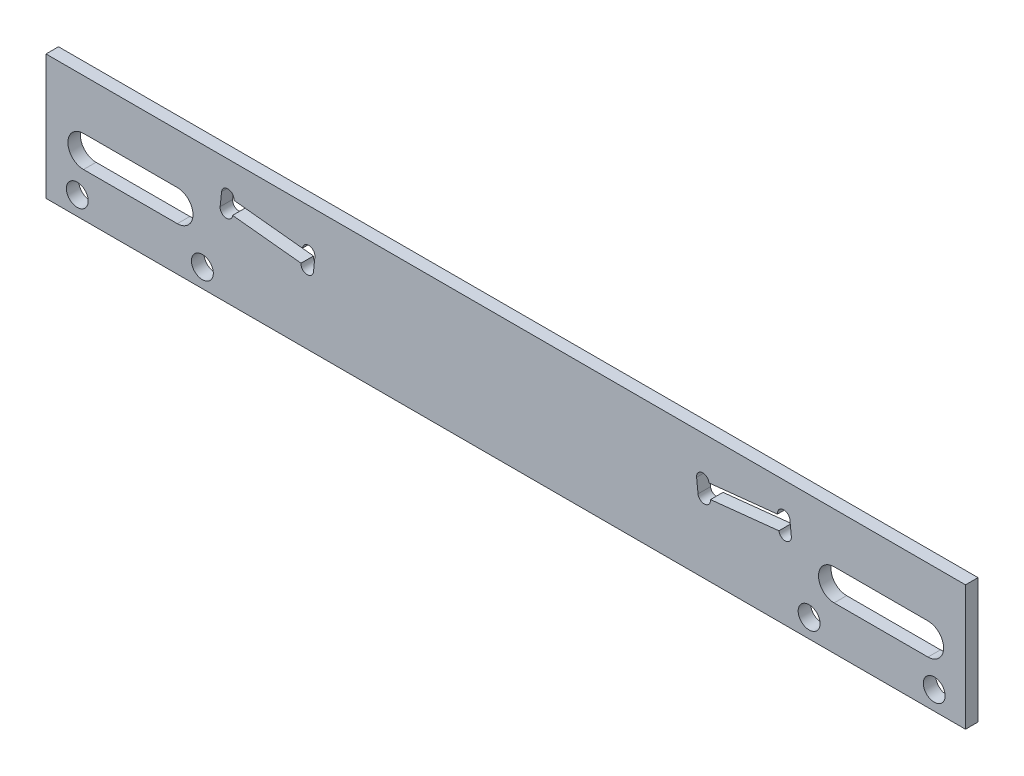
ISO-10303-21;
HEADER;
FILE_DESCRIPTION(('STEP AP214'),'2;1');
FILE_NAME('part.step','',(''),(''),'','','');
FILE_SCHEMA(('AUTOMOTIVE_DESIGN { 1 0 10303 214 1 1 1 1 }'));
ENDSEC;
DATA;
#1=APPLICATION_CONTEXT('core data for automotive mechanical design processes');
#2=APPLICATION_PROTOCOL_DEFINITION('international standard','automotive_design',2000,#1);
#3=PRODUCT_CONTEXT('',#1,'mechanical');
#4=PRODUCT('Part','Part','',(#3));
#5=PRODUCT_RELATED_PRODUCT_CATEGORY('part','',(#4));
#6=PRODUCT_DEFINITION_FORMATION('','',#4);
#7=PRODUCT_DEFINITION_CONTEXT('part definition',#1,'design');
#8=PRODUCT_DEFINITION('design','',#6,#7);
#9=PRODUCT_DEFINITION_SHAPE('','',#8);
#10=(LENGTH_UNIT() NAMED_UNIT(*) SI_UNIT(.MILLI.,.METRE.));
#11=(NAMED_UNIT(*) PLANE_ANGLE_UNIT() SI_UNIT($,.RADIAN.));
#12=(NAMED_UNIT(*) SI_UNIT($,.STERADIAN.) SOLID_ANGLE_UNIT());
#13=UNCERTAINTY_MEASURE_WITH_UNIT(LENGTH_MEASURE(1.E-05),#10,'distance_accuracy_value','');
#14=(GEOMETRIC_REPRESENTATION_CONTEXT(3) GLOBAL_UNCERTAINTY_ASSIGNED_CONTEXT((#13)) GLOBAL_UNIT_ASSIGNED_CONTEXT((#10,
#11,#12)) REPRESENTATION_CONTEXT('',''));
#15=CARTESIAN_POINT('',(0.,0.,0.));
#16=DIRECTION('',(0.,0.,1.));
#17=DIRECTION('',(1.,0.,0.));
#18=AXIS2_PLACEMENT_3D('',#15,#16,#17);
#19=CARTESIAN_POINT('',(0.,0.,2.));
#20=DIRECTION('',(0.,0.,1.));
#21=DIRECTION('',(1.,0.,0.));
#22=AXIS2_PLACEMENT_3D('',#19,#20,#21);
#23=PLANE('',#22);
#24=CARTESIAN_POINT('',(52.5,-0.499999999999997,2.));
#25=DIRECTION('',(0.,0.,1.));
#26=DIRECTION('',(1.,0.,0.));
#27=AXIS2_PLACEMENT_3D('',#24,#25,#26);
#28=CIRCLE('',#27,2.5);
#29=CARTESIAN_POINT('',(52.5,2.,2.));
#30=VERTEX_POINT('',#29);
#31=CARTESIAN_POINT('',(52.5,-3.,2.));
#32=VERTEX_POINT('',#31);
#33=EDGE_CURVE('E256',#30,#32,#28,.T.);
#34=ORIENTED_EDGE('',*,*,#33,.F.);
#35=DIRECTION('',(-1.,0.,0.));
#36=VECTOR('',#35,1.);
#37=CARTESIAN_POINT('',(52.5,2.,2.));
#38=LINE('',#37,#36);
#39=CARTESIAN_POINT('',(67.5,2.,2.));
#40=VERTEX_POINT('',#39);
#41=EDGE_CURVE('E264',#40,#30,#38,.T.);
#42=ORIENTED_EDGE('',*,*,#41,.F.);
#43=CARTESIAN_POINT('',(67.5,-0.499999999999997,2.));
#44=DIRECTION('',(0.,0.,1.));
#45=DIRECTION('',(1.,0.,0.));
#46=AXIS2_PLACEMENT_3D('',#43,#44,#45);
#47=CIRCLE('',#46,2.5);
#48=CARTESIAN_POINT('',(67.5,-3.,2.));
#49=VERTEX_POINT('',#48);
#50=EDGE_CURVE('E278',#49,#40,#47,.T.);
#51=ORIENTED_EDGE('',*,*,#50,.F.);
#52=DIRECTION('',(1.,0.,0.));
#53=VECTOR('',#52,1.);
#54=CARTESIAN_POINT('',(52.5,-3.,2.));
#55=LINE('',#54,#53);
#56=EDGE_CURVE('E275',#32,#49,#55,.T.);
#57=ORIENTED_EDGE('',*,*,#56,.F.);
#58=EDGE_LOOP('',(#34,#42,#51,#57));
#59=FACE_BOUND('',#58,.T.);
#60=CARTESIAN_POINT('',(-68.5,-6.99999999999999,2.));
#61=DIRECTION('',(0.,0.,-1.));
#62=DIRECTION('',(-1.,0.,0.));
#63=AXIS2_PLACEMENT_3D('',#60,#61,#62);
#64=CIRCLE('',#63,1.75);
#65=CARTESIAN_POINT('',(-70.25,-6.99999999999999,2.));
#66=VERTEX_POINT('',#65);
#67=EDGE_CURVE('E292',#66,#66,#64,.T.);
#68=ORIENTED_EDGE('',*,*,#67,.T.);
#69=EDGE_LOOP('',(#68));
#70=FACE_BOUND('',#69,.T.);
#71=CARTESIAN_POINT('',(-48.5,-7.,2.));
#72=DIRECTION('',(0.,0.,-1.));
#73=DIRECTION('',(-1.,0.,0.));
#74=AXIS2_PLACEMENT_3D('',#71,#72,#73);
#75=CIRCLE('',#74,1.75);
#76=CARTESIAN_POINT('',(-50.25,-7.,2.));
#77=VERTEX_POINT('',#76);
#78=EDGE_CURVE('E299',#77,#77,#75,.T.);
#79=ORIENTED_EDGE('',*,*,#78,.T.);
#80=EDGE_LOOP('',(#79));
#81=FACE_BOUND('',#80,.T.);
#82=CARTESIAN_POINT('',(48.5,-6.99999999999999,2.));
#83=DIRECTION('',(0.,0.,-1.));
#84=DIRECTION('',(-1.,0.,0.));
#85=AXIS2_PLACEMENT_3D('',#82,#83,#84);
#86=CIRCLE('',#85,1.75);
#87=CARTESIAN_POINT('',(46.75,-6.99999999999999,2.));
#88=VERTEX_POINT('',#87);
#89=EDGE_CURVE('E305',#88,#88,#86,.T.);
#90=ORIENTED_EDGE('',*,*,#89,.T.);
#91=EDGE_LOOP('',(#90));
#92=FACE_BOUND('',#91,.T.);
#93=CARTESIAN_POINT('',(68.4999999999999,-6.99999999999999,2.));
#94=DIRECTION('',(0.,0.,-1.));
#95=DIRECTION('',(-1.,0.,0.));
#96=AXIS2_PLACEMENT_3D('',#93,#94,#95);
#97=CIRCLE('',#96,1.75);
#98=CARTESIAN_POINT('',(66.7499999999999,-6.99999999999999,2.));
#99=VERTEX_POINT('',#98);
#100=EDGE_CURVE('E311',#99,#99,#97,.T.);
#101=ORIENTED_EDGE('',*,*,#100,.T.);
#102=EDGE_LOOP('',(#101));
#103=FACE_BOUND('',#102,.T.);
#104=CARTESIAN_POINT('',(31.7353868630574,1.31355228558448,2.));
#105=DIRECTION('',(0.,0.,1.));
#106=DIRECTION('',(1.,0.,0.));
#107=AXIS2_PLACEMENT_3D('',#104,#105,#106);
#108=CIRCLE('',#107,0.999999999999998);
#109=CARTESIAN_POINT('',(30.7408649676891,1.20902382231683,2.));
#110=VERTEX_POINT('',#109);
#111=CARTESIAN_POINT('',(32.7299087584256,1.41808074885212,2.));
#112=VERTEX_POINT('',#111);
#113=EDGE_CURVE('E376',#110,#112,#108,.T.);
#114=ORIENTED_EDGE('',*,*,#113,.F.);
#115=DIRECTION('',(0.104528463267649,-0.994521895368274,0.));
#116=VECTOR('',#115,1.);
#117=CARTESIAN_POINT('',(30.5109023485003,3.39697199212703,2.));
#118=LINE('',#117,#116);
#119=CARTESIAN_POINT('',(30.5109023485003,3.39697199212703,2.));
#120=VERTEX_POINT('',#119);
#121=EDGE_CURVE('E398',#120,#110,#118,.T.);
#122=ORIENTED_EDGE('',*,*,#121,.F.);
#123=CARTESIAN_POINT('',(31.5054242438685,3.50150045539468,2.));
#124=DIRECTION('',(0.,0.,1.));
#125=DIRECTION('',(1.,0.,0.));
#126=AXIS2_PLACEMENT_3D('',#123,#124,#125);
#127=CIRCLE('',#126,0.999999999999998);
#128=CARTESIAN_POINT('',(32.4999461392368,3.60602891866233,2.));
#129=VERTEX_POINT('',#128);
#130=EDGE_CURVE('E375',#129,#120,#127,.T.);
#131=ORIENTED_EDGE('',*,*,#130,.F.);
#132=DIRECTION('',(-0.994521895368274,-0.10452846326765,0.));
#133=VECTOR('',#132,1.);
#134=CARTESIAN_POINT('',(45.4287307790244,4.96489894114178,2.));
#135=LINE('',#134,#133);
#136=CARTESIAN_POINT('',(43.4396869882878,4.75584201460648,2.));
#137=VERTEX_POINT('',#136);
#138=EDGE_CURVE('E395',#137,#129,#135,.T.);
#139=ORIENTED_EDGE('',*,*,#138,.F.);
#140=CARTESIAN_POINT('',(44.4342088836561,4.86037047787413,2.));
#141=DIRECTION('',(0.,0.,1.));
#142=DIRECTION('',(1.,0.,0.));
#143=AXIS2_PLACEMENT_3D('',#140,#141,#142);
#144=CIRCLE('',#143,0.999999999999998);
#145=CARTESIAN_POINT('',(45.4287307790244,4.96489894114178,2.));
#146=VERTEX_POINT('',#145);
#147=EDGE_CURVE('E370',#146,#137,#144,.T.);
#148=ORIENTED_EDGE('',*,*,#147,.F.);
#149=DIRECTION('',(-0.104528463267651,0.994521895368274,0.));
#150=VECTOR('',#149,1.);
#151=CARTESIAN_POINT('',(45.6586933982132,2.77695077133158,2.));
#152=LINE('',#151,#150);
#153=CARTESIAN_POINT('',(45.6586933982132,2.77695077133158,2.));
#154=VERTEX_POINT('',#153);
#155=EDGE_CURVE('E404',#154,#146,#152,.T.);
#156=ORIENTED_EDGE('',*,*,#155,.F.);
#157=CARTESIAN_POINT('',(44.6641715028449,2.67242230806393,2.));
#158=DIRECTION('',(0.,0.,1.));
#159=DIRECTION('',(1.,0.,0.));
#160=AXIS2_PLACEMENT_3D('',#157,#158,#159);
#161=CIRCLE('',#160,0.999999999999998);
#162=CARTESIAN_POINT('',(43.6696496074767,2.56789384479628,2.));
#163=VERTEX_POINT('',#162);
#164=EDGE_CURVE('E359',#163,#154,#161,.T.);
#165=ORIENTED_EDGE('',*,*,#164,.F.);
#166=DIRECTION('',(0.994521895368274,0.10452846326765,0.));
#167=VECTOR('',#166,1.);
#168=CARTESIAN_POINT('',(30.7408649676891,1.20902382231683,2.));
#169=LINE('',#168,#167);
#170=EDGE_CURVE('E401',#112,#163,#169,.T.);
#171=ORIENTED_EDGE('',*,*,#170,.F.);
#172=EDGE_LOOP('',(#114,#122,#131,#139,#148,#156,#165,#171));
#173=FACE_BOUND('',#172,.T.);
#174=DIRECTION('',(0.,1.,0.));
#175=VECTOR('',#174,1.);
#176=CARTESIAN_POINT('',(73.5,10.,2.));
#177=LINE('',#176,#175);
#178=CARTESIAN_POINT('',(73.5,-10.,2.));
#179=VERTEX_POINT('',#178);
#180=CARTESIAN_POINT('',(73.5,10.,2.));
#181=VERTEX_POINT('',#180);
#182=EDGE_CURVE('E418',#179,#181,#177,.T.);
#183=ORIENTED_EDGE('',*,*,#182,.T.);
#184=DIRECTION('',(-1.,0.,0.));
#185=VECTOR('',#184,1.);
#186=CARTESIAN_POINT('',(-73.5,10.,2.));
#187=LINE('',#186,#185);
#188=CARTESIAN_POINT('',(-73.5,10.,2.));
#189=VERTEX_POINT('',#188);
#190=EDGE_CURVE('E421',#181,#189,#187,.T.);
#191=ORIENTED_EDGE('',*,*,#190,.T.);
#192=DIRECTION('',(0.,-1.,0.));
#193=VECTOR('',#192,1.);
#194=CARTESIAN_POINT('',(-73.5,10.,2.));
#195=LINE('',#194,#193);
#196=CARTESIAN_POINT('',(-73.5,-10.,2.));
#197=VERTEX_POINT('',#196);
#198=EDGE_CURVE('E424',#189,#197,#195,.T.);
#199=ORIENTED_EDGE('',*,*,#198,.T.);
#200=DIRECTION('',(1.,0.,0.));
#201=VECTOR('',#200,1.);
#202=CARTESIAN_POINT('',(-73.5,-10.,2.));
#203=LINE('',#202,#201);
#204=EDGE_CURVE('E426',#197,#179,#203,.T.);
#205=ORIENTED_EDGE('',*,*,#204,.T.);
#206=EDGE_LOOP('',(#183,#191,#199,#205));
#207=FACE_BOUND('',#206,.T.);
#208=DIRECTION('',(-0.104528463267649,-0.994521895368274,0.));
#209=VECTOR('',#208,1.);
#210=CARTESIAN_POINT('',(-30.5109023485003,3.39697199212703,2.));
#211=LINE('',#210,#209);
#212=CARTESIAN_POINT('',(-30.5109023485003,3.39697199212703,2.));
#213=VERTEX_POINT('',#212);
#214=CARTESIAN_POINT('',(-30.7408649676891,1.20902382231683,2.));
#215=VERTEX_POINT('',#214);
#216=EDGE_CURVE('E353',#213,#215,#211,.T.);
#217=ORIENTED_EDGE('',*,*,#216,.T.);
#218=CARTESIAN_POINT('',(-31.7353868630574,1.31355228558448,2.));
#219=DIRECTION('',(0.,0.,-1.));
#220=DIRECTION('',(-1.,0.,0.));
#221=AXIS2_PLACEMENT_3D('',#218,#219,#220);
#222=CIRCLE('',#221,0.999999999999998);
#223=CARTESIAN_POINT('',(-32.7299087584256,1.41808074885212,2.));
#224=VERTEX_POINT('',#223);
#225=EDGE_CURVE('E324',#215,#224,#222,.T.);
#226=ORIENTED_EDGE('',*,*,#225,.T.);
#227=DIRECTION('',(-0.994521895368274,0.10452846326765,0.));
#228=VECTOR('',#227,1.);
#229=CARTESIAN_POINT('',(-30.7408649676891,1.20902382231683,2.));
#230=LINE('',#229,#228);
#231=CARTESIAN_POINT('',(-43.6696496074767,2.56789384479628,2.));
#232=VERTEX_POINT('',#231);
#233=EDGE_CURVE('E350',#224,#232,#230,.T.);
#234=ORIENTED_EDGE('',*,*,#233,.T.);
#235=CARTESIAN_POINT('',(-44.6641715028449,2.67242230806393,2.));
#236=DIRECTION('',(0.,0.,-1.));
#237=DIRECTION('',(-1.,0.,0.));
#238=AXIS2_PLACEMENT_3D('',#235,#236,#237);
#239=CIRCLE('',#238,0.999999999999998);
#240=CARTESIAN_POINT('',(-45.6586933982132,2.77695077133158,2.));
#241=VERTEX_POINT('',#240);
#242=EDGE_CURVE('E295',#232,#241,#239,.T.);
#243=ORIENTED_EDGE('',*,*,#242,.T.);
#244=DIRECTION('',(0.104528463267651,0.994521895368274,0.));
#245=VECTOR('',#244,1.);
#246=CARTESIAN_POINT('',(-45.6586933982132,2.77695077133158,2.));
#247=LINE('',#246,#245);
#248=CARTESIAN_POINT('',(-45.4287307790244,4.96489894114178,2.));
#249=VERTEX_POINT('',#248);
#250=EDGE_CURVE('E347',#241,#249,#247,.T.);
#251=ORIENTED_EDGE('',*,*,#250,.T.);
#252=CARTESIAN_POINT('',(-44.4342088836561,4.86037047787413,2.));
#253=DIRECTION('',(0.,0.,-1.));
#254=DIRECTION('',(-1.,0.,0.));
#255=AXIS2_PLACEMENT_3D('',#252,#253,#254);
#256=CIRCLE('',#255,0.999999999999998);
#257=CARTESIAN_POINT('',(-43.4396869882878,4.75584201460648,2.));
#258=VERTEX_POINT('',#257);
#259=EDGE_CURVE('E318',#249,#258,#256,.T.);
#260=ORIENTED_EDGE('',*,*,#259,.T.);
#261=DIRECTION('',(0.994521895368274,-0.10452846326765,0.));
#262=VECTOR('',#261,1.);
#263=CARTESIAN_POINT('',(-45.4287307790244,4.96489894114178,2.));
#264=LINE('',#263,#262);
#265=CARTESIAN_POINT('',(-32.4999461392368,3.60602891866233,2.));
#266=VERTEX_POINT('',#265);
#267=EDGE_CURVE('E344',#258,#266,#264,.T.);
#268=ORIENTED_EDGE('',*,*,#267,.T.);
#269=CARTESIAN_POINT('',(-31.5054242438685,3.50150045539468,2.));
#270=DIRECTION('',(0.,0.,-1.));
#271=DIRECTION('',(-1.,0.,0.));
#272=AXIS2_PLACEMENT_3D('',#269,#270,#271);
#273=CIRCLE('',#272,0.999999999999998);
#274=EDGE_CURVE('E323',#266,#213,#273,.T.);
#275=ORIENTED_EDGE('',*,*,#274,.T.);
#276=EDGE_LOOP('',(#217,#226,#234,#243,#251,#260,#268,#275));
#277=FACE_BOUND('',#276,.T.);
#278=DIRECTION('',(1.,0.,0.));
#279=VECTOR('',#278,1.);
#280=CARTESIAN_POINT('',(-52.5,2.,2.));
#281=LINE('',#280,#279);
#282=CARTESIAN_POINT('',(-67.5,2.,2.));
#283=VERTEX_POINT('',#282);
#284=CARTESIAN_POINT('',(-52.5,2.,2.));
#285=VERTEX_POINT('',#284);
#286=EDGE_CURVE('E250',#283,#285,#281,.T.);
#287=ORIENTED_EDGE('',*,*,#286,.T.);
#288=CARTESIAN_POINT('',(-52.5,-0.499999999999997,2.));
#289=DIRECTION('',(0.,0.,-1.));
#290=DIRECTION('',(-1.,0.,0.));
#291=AXIS2_PLACEMENT_3D('',#288,#289,#290);
#292=CIRCLE('',#291,2.5);
#293=CARTESIAN_POINT('',(-52.5,-3.,2.));
#294=VERTEX_POINT('',#293);
#295=EDGE_CURVE('E55',#285,#294,#292,.T.);
#296=ORIENTED_EDGE('',*,*,#295,.T.);
#297=DIRECTION('',(-1.,0.,0.));
#298=VECTOR('',#297,1.);
#299=CARTESIAN_POINT('',(-52.5,-3.,2.));
#300=LINE('',#299,#298);
#301=CARTESIAN_POINT('',(-67.5,-3.,2.));
#302=VERTEX_POINT('',#301);
#303=EDGE_CURVE('E241',#294,#302,#300,.T.);
#304=ORIENTED_EDGE('',*,*,#303,.T.);
#305=CARTESIAN_POINT('',(-67.5,-0.499999999999997,2.));
#306=DIRECTION('',(0.,0.,-1.));
#307=DIRECTION('',(-1.,0.,0.));
#308=AXIS2_PLACEMENT_3D('',#305,#306,#307);
#309=CIRCLE('',#308,2.5);
#310=EDGE_CURVE('E244',#302,#283,#309,.T.);
#311=ORIENTED_EDGE('',*,*,#310,.T.);
#312=EDGE_LOOP('',(#287,#296,#304,#311));
#313=FACE_BOUND('',#312,.T.);
#314=ADVANCED_FACE('F40',(#59,#70,#81,#92,#103,#173,#207,#277,#313),#23,.T.);
#315=CARTESIAN_POINT('',(0.,0.,0.));
#316=DIRECTION('',(0.,0.,1.));
#317=DIRECTION('',(1.,0.,0.));
#318=AXIS2_PLACEMENT_3D('',#315,#316,#317);
#319=PLANE('',#318);
#320=DIRECTION('',(0.104528463267649,-0.994521895368274,0.));
#321=VECTOR('',#320,1.);
#322=CARTESIAN_POINT('',(30.5306692337265,3.20890264196001,0.));
#323=LINE('',#322,#321);
#324=CARTESIAN_POINT('',(30.5109023485003,3.39697199212703,0.));
#325=VERTEX_POINT('',#324);
#326=CARTESIAN_POINT('',(30.7408649676891,1.20902382231683,0.));
#327=VERTEX_POINT('',#326);
#328=EDGE_CURVE('E447',#325,#327,#323,.T.);
#329=ORIENTED_EDGE('',*,*,#328,.T.);
#330=CARTESIAN_POINT('',(31.7353868630574,1.31355228558448,0.));
#331=DIRECTION('',(0.,0.,1.));
#332=DIRECTION('',(1.,0.,0.));
#333=AXIS2_PLACEMENT_3D('',#330,#331,#332);
#334=CIRCLE('',#333,0.999999999999998);
#335=CARTESIAN_POINT('',(32.7299087584256,1.41808074885212,0.));
#336=VERTEX_POINT('',#335);
#337=EDGE_CURVE('E372',#327,#336,#334,.T.);
#338=ORIENTED_EDGE('',*,*,#337,.T.);
#339=DIRECTION('',(0.994521895368274,0.10452846326765,0.));
#340=VECTOR('',#339,1.);
#341=CARTESIAN_POINT('',(0.210195733962616,-1.9998788196432,0.));
#342=LINE('',#341,#340);
#343=CARTESIAN_POINT('',(43.6696496074767,2.56789384479628,0.));
#344=VERTEX_POINT('',#343);
#345=EDGE_CURVE('E450',#336,#344,#342,.T.);
#346=ORIENTED_EDGE('',*,*,#345,.T.);
#347=CARTESIAN_POINT('',(44.6641715028449,2.67242230806393,0.));
#348=DIRECTION('',(0.,0.,1.));
#349=DIRECTION('',(1.,0.,0.));
#350=AXIS2_PLACEMENT_3D('',#347,#348,#349);
#351=CIRCLE('',#350,0.999999999999998);
#352=CARTESIAN_POINT('',(45.6586933982132,2.77695077133158,0.));
#353=VERTEX_POINT('',#352);
#354=EDGE_CURVE('E367',#344,#353,#351,.T.);
#355=ORIENTED_EDGE('',*,*,#354,.T.);
#356=DIRECTION('',(-0.104528463267651,0.994521895368274,0.));
#357=VECTOR('',#356,1.);
#358=CARTESIAN_POINT('',(45.4484976642506,4.77682959097483,0.));
#359=LINE('',#358,#357);
#360=CARTESIAN_POINT('',(45.4287307790244,4.96489894114178,0.));
#361=VERTEX_POINT('',#360);
#362=EDGE_CURVE('E453',#353,#361,#359,.T.);
#363=ORIENTED_EDGE('',*,*,#362,.T.);
#364=CARTESIAN_POINT('',(44.4342088836561,4.86037047787413,0.));
#365=DIRECTION('',(0.,0.,1.));
#366=DIRECTION('',(1.,0.,0.));
#367=AXIS2_PLACEMENT_3D('',#364,#365,#366);
#368=CIRCLE('',#367,0.999999999999998);
#369=CARTESIAN_POINT('',(43.4396869882878,4.75584201460648,0.));
#370=VERTEX_POINT('',#369);
#371=EDGE_CURVE('E378',#361,#370,#368,.T.);
#372=ORIENTED_EDGE('',*,*,#371,.T.);
#373=DIRECTION('',(-0.994521895368274,-0.10452846326765,0.));
#374=VECTOR('',#373,1.);
#375=CARTESIAN_POINT('',(-0.0197668852262152,0.188069350167006,0.));
#376=LINE('',#375,#374);
#377=CARTESIAN_POINT('',(32.4999461392368,3.60602891866233,0.));
#378=VERTEX_POINT('',#377);
#379=EDGE_CURVE('E456',#370,#378,#376,.T.);
#380=ORIENTED_EDGE('',*,*,#379,.T.);
#381=CARTESIAN_POINT('',(31.5054242438685,3.50150045539468,0.));
#382=DIRECTION('',(0.,0.,1.));
#383=DIRECTION('',(1.,0.,0.));
#384=AXIS2_PLACEMENT_3D('',#381,#382,#383);
#385=CIRCLE('',#384,0.999999999999998);
#386=EDGE_CURVE('E382',#378,#325,#385,.T.);
#387=ORIENTED_EDGE('',*,*,#386,.T.);
#388=EDGE_LOOP('',(#329,#338,#346,#355,#363,#372,#380,#387));
#389=FACE_BOUND('',#388,.T.);
#390=DIRECTION('',(0.,1.,0.));
#391=VECTOR('',#390,1.);
#392=CARTESIAN_POINT('',(73.5,10.,0.));
#393=LINE('',#392,#391);
#394=CARTESIAN_POINT('',(73.5,-10.,0.));
#395=VERTEX_POINT('',#394);
#396=CARTESIAN_POINT('',(73.5,10.,0.));
#397=VERTEX_POINT('',#396);
#398=EDGE_CURVE('E410',#395,#397,#393,.T.);
#399=ORIENTED_EDGE('',*,*,#398,.F.);
#400=DIRECTION('',(1.,0.,0.));
#401=VECTOR('',#400,1.);
#402=CARTESIAN_POINT('',(-73.5,-10.,0.));
#403=LINE('',#402,#401);
#404=CARTESIAN_POINT('',(-73.5,-10.,0.));
#405=VERTEX_POINT('',#404);
#406=EDGE_CURVE('E422',#405,#395,#403,.T.);
#407=ORIENTED_EDGE('',*,*,#406,.F.);
#408=DIRECTION('',(0.,-1.,0.));
#409=VECTOR('',#408,1.);
#410=CARTESIAN_POINT('',(-73.5,10.,0.));
#411=LINE('',#410,#409);
#412=CARTESIAN_POINT('',(-73.5,10.,0.));
#413=VERTEX_POINT('',#412);
#414=EDGE_CURVE('E433',#413,#405,#411,.T.);
#415=ORIENTED_EDGE('',*,*,#414,.F.);
#416=DIRECTION('',(-1.,0.,0.));
#417=VECTOR('',#416,1.);
#418=CARTESIAN_POINT('',(-73.5,10.,0.));
#419=LINE('',#418,#417);
#420=EDGE_CURVE('E431',#397,#413,#419,.T.);
#421=ORIENTED_EDGE('',*,*,#420,.F.);
#422=EDGE_LOOP('',(#399,#407,#415,#421));
#423=FACE_BOUND('',#422,.T.);
#424=CARTESIAN_POINT('',(-31.7353868630574,1.31355228558448,0.));
#425=DIRECTION('',(0.,0.,-1.));
#426=DIRECTION('',(-1.,0.,0.));
#427=AXIS2_PLACEMENT_3D('',#424,#425,#426);
#428=CIRCLE('',#427,0.999999999999998);
#429=CARTESIAN_POINT('',(-30.7408649676891,1.20902382231683,0.));
#430=VERTEX_POINT('',#429);
#431=CARTESIAN_POINT('',(-32.7299087584256,1.41808074885212,0.));
#432=VERTEX_POINT('',#431);
#433=EDGE_CURVE('E321',#430,#432,#428,.T.);
#434=ORIENTED_EDGE('',*,*,#433,.F.);
#435=DIRECTION('',(-0.104528463267649,-0.994521895368274,0.));
#436=VECTOR('',#435,1.);
#437=CARTESIAN_POINT('',(-30.5306692337265,3.20890264196001,0.));
#438=LINE('',#437,#436);
#439=CARTESIAN_POINT('',(-30.5109023485003,3.39697199212703,0.));
#440=VERTEX_POINT('',#439);
#441=EDGE_CURVE('E468',#440,#430,#438,.T.);
#442=ORIENTED_EDGE('',*,*,#441,.F.);
#443=CARTESIAN_POINT('',(-31.5054242438685,3.50150045539468,0.));
#444=DIRECTION('',(0.,0.,-1.));
#445=DIRECTION('',(-1.,0.,0.));
#446=AXIS2_PLACEMENT_3D('',#443,#444,#445);
#447=CIRCLE('',#446,0.999999999999998);
#448=CARTESIAN_POINT('',(-32.4999461392368,3.60602891866233,0.));
#449=VERTEX_POINT('',#448);
#450=EDGE_CURVE('E331',#449,#440,#447,.T.);
#451=ORIENTED_EDGE('',*,*,#450,.F.);
#452=DIRECTION('',(0.994521895368274,-0.10452846326765,0.));
#453=VECTOR('',#452,1.);
#454=CARTESIAN_POINT('',(0.0197668852262152,0.188069350167006,0.));
#455=LINE('',#454,#453);
#456=CARTESIAN_POINT('',(-43.4396869882878,4.75584201460648,0.));
#457=VERTEX_POINT('',#456);
#458=EDGE_CURVE('E48',#457,#449,#455,.T.);
#459=ORIENTED_EDGE('',*,*,#458,.F.);
#460=CARTESIAN_POINT('',(-44.4342088836561,4.86037047787413,0.));
#461=DIRECTION('',(0.,0.,-1.));
#462=DIRECTION('',(-1.,0.,0.));
#463=AXIS2_PLACEMENT_3D('',#460,#461,#462);
#464=CIRCLE('',#463,0.999999999999998);
#465=CARTESIAN_POINT('',(-45.4287307790244,4.96489894114178,0.));
#466=VERTEX_POINT('',#465);
#467=EDGE_CURVE('E327',#466,#457,#464,.T.);
#468=ORIENTED_EDGE('',*,*,#467,.F.);
#469=DIRECTION('',(0.104528463267651,0.994521895368274,0.));
#470=VECTOR('',#469,1.);
#471=CARTESIAN_POINT('',(-45.4484976642506,4.77682959097483,0.));
#472=LINE('',#471,#470);
#473=CARTESIAN_POINT('',(-45.6586933982132,2.77695077133158,0.));
#474=VERTEX_POINT('',#473);
#475=EDGE_CURVE('E462',#474,#466,#472,.T.);
#476=ORIENTED_EDGE('',*,*,#475,.F.);
#477=CARTESIAN_POINT('',(-44.6641715028449,2.67242230806393,0.));
#478=DIRECTION('',(0.,0.,-1.));
#479=DIRECTION('',(-1.,0.,0.));
#480=AXIS2_PLACEMENT_3D('',#477,#478,#479);
#481=CIRCLE('',#480,0.999999999999998);
#482=CARTESIAN_POINT('',(-43.6696496074767,2.56789384479628,0.));
#483=VERTEX_POINT('',#482);
#484=EDGE_CURVE('E316',#483,#474,#481,.T.);
#485=ORIENTED_EDGE('',*,*,#484,.F.);
#486=DIRECTION('',(-0.994521895368274,0.10452846326765,0.));
#487=VECTOR('',#486,1.);
#488=CARTESIAN_POINT('',(-0.210195733962616,-1.9998788196432,0.));
#489=LINE('',#488,#487);
#490=EDGE_CURVE('E465',#432,#483,#489,.T.);
#491=ORIENTED_EDGE('',*,*,#490,.F.);
#492=EDGE_LOOP('',(#434,#442,#451,#459,#468,#476,#485,#491));
#493=FACE_BOUND('',#492,.T.);
#494=CARTESIAN_POINT('',(68.4999999999999,-6.99999999999999,0.));
#495=DIRECTION('',(0.,0.,-1.));
#496=DIRECTION('',(-1.,0.,0.));
#497=AXIS2_PLACEMENT_3D('',#494,#495,#496);
#498=CIRCLE('',#497,1.75);
#499=CARTESIAN_POINT('',(66.7499999999999,-6.99999999999999,0.));
#500=VERTEX_POINT('',#499);
#501=EDGE_CURVE('E285',#500,#500,#498,.T.);
#502=ORIENTED_EDGE('',*,*,#501,.F.);
#503=EDGE_LOOP('',(#502));
#504=FACE_BOUND('',#503,.T.);
#505=CARTESIAN_POINT('',(48.5,-6.99999999999999,0.));
#506=DIRECTION('',(0.,0.,-1.));
#507=DIRECTION('',(-1.,0.,0.));
#508=AXIS2_PLACEMENT_3D('',#505,#506,#507);
#509=CIRCLE('',#508,1.75);
#510=CARTESIAN_POINT('',(46.75,-6.99999999999999,0.));
#511=VERTEX_POINT('',#510);
#512=EDGE_CURVE('E308',#511,#511,#509,.T.);
#513=ORIENTED_EDGE('',*,*,#512,.F.);
#514=EDGE_LOOP('',(#513));
#515=FACE_BOUND('',#514,.T.);
#516=CARTESIAN_POINT('',(-48.5,-7.,0.));
#517=DIRECTION('',(0.,0.,-1.));
#518=DIRECTION('',(-1.,0.,0.));
#519=AXIS2_PLACEMENT_3D('',#516,#517,#518);
#520=CIRCLE('',#519,1.75);
#521=CARTESIAN_POINT('',(-50.25,-7.,0.));
#522=VERTEX_POINT('',#521);
#523=EDGE_CURVE('E302',#522,#522,#520,.T.);
#524=ORIENTED_EDGE('',*,*,#523,.F.);
#525=EDGE_LOOP('',(#524));
#526=FACE_BOUND('',#525,.T.);
#527=CARTESIAN_POINT('',(-68.5,-6.99999999999999,0.));
#528=DIRECTION('',(0.,0.,-1.));
#529=DIRECTION('',(-1.,0.,0.));
#530=AXIS2_PLACEMENT_3D('',#527,#528,#529);
#531=CIRCLE('',#530,1.75);
#532=CARTESIAN_POINT('',(-70.25,-6.99999999999999,0.));
#533=VERTEX_POINT('',#532);
#534=EDGE_CURVE('E296',#533,#533,#531,.T.);
#535=ORIENTED_EDGE('',*,*,#534,.F.);
#536=EDGE_LOOP('',(#535));
#537=FACE_BOUND('',#536,.T.);
#538=DIRECTION('',(-1.,0.,0.));
#539=VECTOR('',#538,1.);
#540=CARTESIAN_POINT('',(52.5,2.,0.));
#541=LINE('',#540,#539);
#542=CARTESIAN_POINT('',(67.5,2.,0.));
#543=VERTEX_POINT('',#542);
#544=CARTESIAN_POINT('',(52.5,2.,0.));
#545=VERTEX_POINT('',#544);
#546=EDGE_CURVE('E270',#543,#545,#541,.T.);
#547=ORIENTED_EDGE('',*,*,#546,.T.);
#548=CARTESIAN_POINT('',(52.5,-0.499999999999997,0.));
#549=DIRECTION('',(0.,0.,1.));
#550=DIRECTION('',(1.,0.,0.));
#551=AXIS2_PLACEMENT_3D('',#548,#549,#550);
#552=CIRCLE('',#551,2.5);
#553=CARTESIAN_POINT('',(52.5,-3.,0.));
#554=VERTEX_POINT('',#553);
#555=EDGE_CURVE('E260',#545,#554,#552,.T.);
#556=ORIENTED_EDGE('',*,*,#555,.T.);
#557=DIRECTION('',(1.,0.,0.));
#558=VECTOR('',#557,1.);
#559=CARTESIAN_POINT('',(52.5,-3.,0.));
#560=LINE('',#559,#558);
#561=CARTESIAN_POINT('',(67.5,-3.,0.));
#562=VERTEX_POINT('',#561);
#563=EDGE_CURVE('E263',#554,#562,#560,.T.);
#564=ORIENTED_EDGE('',*,*,#563,.T.);
#565=CARTESIAN_POINT('',(67.5,-0.499999999999997,0.));
#566=DIRECTION('',(0.,0.,1.));
#567=DIRECTION('',(1.,0.,0.));
#568=AXIS2_PLACEMENT_3D('',#565,#566,#567);
#569=CIRCLE('',#568,2.5);
#570=EDGE_CURVE('E267',#562,#543,#569,.T.);
#571=ORIENTED_EDGE('',*,*,#570,.T.);
#572=EDGE_LOOP('',(#547,#556,#564,#571));
#573=FACE_BOUND('',#572,.T.);
#574=CARTESIAN_POINT('',(-52.5,-0.499999999999997,0.));
#575=DIRECTION('',(0.,0.,-1.));
#576=DIRECTION('',(-1.,0.,0.));
#577=AXIS2_PLACEMENT_3D('',#574,#575,#576);
#578=CIRCLE('',#577,2.5);
#579=CARTESIAN_POINT('',(-52.5,2.,0.));
#580=VERTEX_POINT('',#579);
#581=CARTESIAN_POINT('',(-52.5,-3.,0.));
#582=VERTEX_POINT('',#581);
#583=EDGE_CURVE('E233',#580,#582,#578,.T.);
#584=ORIENTED_EDGE('',*,*,#583,.F.);
#585=DIRECTION('',(1.,0.,0.));
#586=VECTOR('',#585,1.);
#587=CARTESIAN_POINT('',(-52.5,2.,0.));
#588=LINE('',#587,#586);
#589=CARTESIAN_POINT('',(-67.5,2.,0.));
#590=VERTEX_POINT('',#589);
#591=EDGE_CURVE('E225',#590,#580,#588,.T.);
#592=ORIENTED_EDGE('',*,*,#591,.F.);
#593=CARTESIAN_POINT('',(-67.5,-0.499999999999997,0.));
#594=DIRECTION('',(0.,0.,-1.));
#595=DIRECTION('',(-1.,0.,0.));
#596=AXIS2_PLACEMENT_3D('',#593,#594,#595);
#597=CIRCLE('',#596,2.5);
#598=CARTESIAN_POINT('',(-67.5,-3.,0.));
#599=VERTEX_POINT('',#598);
#600=EDGE_CURVE('E232',#599,#590,#597,.T.);
#601=ORIENTED_EDGE('',*,*,#600,.F.);
#602=DIRECTION('',(-1.,0.,0.));
#603=VECTOR('',#602,1.);
#604=CARTESIAN_POINT('',(-52.5,-3.,0.));
#605=LINE('',#604,#603);
#606=EDGE_CURVE('E237',#582,#599,#605,.T.);
#607=ORIENTED_EDGE('',*,*,#606,.F.);
#608=EDGE_LOOP('',(#584,#592,#601,#607));
#609=FACE_BOUND('',#608,.T.);
#610=ADVANCED_FACE('F240',(#389,#423,#493,#504,#515,#526,#537,#573,#609),#319,.F.);
#611=CARTESIAN_POINT('',(-45.4287307790244,4.96489894114178,-1.));
#612=DIRECTION('',(-0.10452846326765,-0.994521895368274,0.));
#613=DIRECTION('',(0.994521895368274,-0.10452846326765,0.));
#614=AXIS2_PLACEMENT_3D('',#611,#612,#613);
#615=PLANE('',#614);
#616=ORIENTED_EDGE('',*,*,#267,.F.);
#617=DIRECTION('',(0.,0.,1.));
#618=VECTOR('',#617,1.);
#619=CARTESIAN_POINT('',(-43.4396869882878,4.75584201460648,0.));
#620=LINE('',#619,#618);
#621=EDGE_CURVE('E338',#258,#457,#620,.F.);
#622=ORIENTED_EDGE('',*,*,#621,.T.);
#623=ORIENTED_EDGE('',*,*,#458,.T.);
#624=DIRECTION('',(0.,0.,1.));
#625=VECTOR('',#624,1.);
#626=CARTESIAN_POINT('',(-32.4999461392368,3.60602891866233,0.));
#627=LINE('',#626,#625);
#628=EDGE_CURVE('E341',#449,#266,#627,.T.);
#629=ORIENTED_EDGE('',*,*,#628,.T.);
#630=EDGE_LOOP('',(#616,#622,#623,#629));
#631=FACE_BOUND('',#630,.T.);
#632=ADVANCED_FACE('F474',(#631),#615,.T.);
#633=CARTESIAN_POINT('',(-30.7408649676891,1.20902382231683,-1.));
#634=DIRECTION('',(0.10452846326765,0.994521895368274,0.));
#635=DIRECTION('',(-0.994521895368274,0.10452846326765,0.));
#636=AXIS2_PLACEMENT_3D('',#633,#634,#635);
#637=PLANE('',#636);
#638=ORIENTED_EDGE('',*,*,#233,.F.);
#639=DIRECTION('',(0.,0.,1.));
#640=VECTOR('',#639,1.);
#641=CARTESIAN_POINT('',(-32.7299087584256,1.41808074885212,0.));
#642=LINE('',#641,#640);
#643=EDGE_CURVE('E11',#224,#432,#642,.F.);
#644=ORIENTED_EDGE('',*,*,#643,.T.);
#645=ORIENTED_EDGE('',*,*,#490,.T.);
#646=DIRECTION('',(0.,0.,1.));
#647=VECTOR('',#646,1.);
#648=CARTESIAN_POINT('',(-43.6696496074767,2.56789384479628,0.));
#649=LINE('',#648,#647);
#650=EDGE_CURVE('E333',#483,#232,#649,.T.);
#651=ORIENTED_EDGE('',*,*,#650,.T.);
#652=EDGE_LOOP('',(#638,#644,#645,#651));
#653=FACE_BOUND('',#652,.T.);
#654=ADVANCED_FACE('F501',(#653),#637,.T.);
#655=CARTESIAN_POINT('',(73.5,10.,2.));
#656=DIRECTION('',(-1.,0.,0.));
#657=DIRECTION('',(0.,-1.,0.));
#658=AXIS2_PLACEMENT_3D('',#655,#656,#657);
#659=PLANE('',#658);
#660=ORIENTED_EDGE('',*,*,#398,.T.);
#661=DIRECTION('',(0.,0.,-1.));
#662=VECTOR('',#661,1.);
#663=CARTESIAN_POINT('',(73.5,10.,2.));
#664=LINE('',#663,#662);
#665=EDGE_CURVE('E444',#181,#397,#664,.T.);
#666=ORIENTED_EDGE('',*,*,#665,.F.);
#667=ORIENTED_EDGE('',*,*,#182,.F.);
#668=DIRECTION('',(0.,0.,-1.));
#669=VECTOR('',#668,1.);
#670=CARTESIAN_POINT('',(73.5,-10.,2.));
#671=LINE('',#670,#669);
#672=EDGE_CURVE('E428',#179,#395,#671,.T.);
#673=ORIENTED_EDGE('',*,*,#672,.T.);
#674=EDGE_LOOP('',(#660,#666,#667,#673));
#675=FACE_BOUND('',#674,.T.);
#676=ADVANCED_FACE('F42',(#675),#659,.F.);
#677=CARTESIAN_POINT('',(-73.5,10.,2.));
#678=DIRECTION('',(0.,-1.,0.));
#679=DIRECTION('',(0.,0.,-1.));
#680=AXIS2_PLACEMENT_3D('',#677,#678,#679);
#681=PLANE('',#680);
#682=ORIENTED_EDGE('',*,*,#420,.T.);
#683=DIRECTION('',(0.,0.,-1.));
#684=VECTOR('',#683,1.);
#685=CARTESIAN_POINT('',(-73.5,10.,2.));
#686=LINE('',#685,#684);
#687=EDGE_CURVE('E441',#189,#413,#686,.T.);
#688=ORIENTED_EDGE('',*,*,#687,.F.);
#689=ORIENTED_EDGE('',*,*,#190,.F.);
#690=ORIENTED_EDGE('',*,*,#665,.T.);
#691=EDGE_LOOP('',(#682,#688,#689,#690));
#692=FACE_BOUND('',#691,.T.);
#693=ADVANCED_FACE('F535',(#692),#681,.F.);
#694=CARTESIAN_POINT('',(-73.5,10.,2.));
#695=DIRECTION('',(1.,0.,0.));
#696=DIRECTION('',(0.,0.,-1.));
#697=AXIS2_PLACEMENT_3D('',#694,#695,#696);
#698=PLANE('',#697);
#699=ORIENTED_EDGE('',*,*,#414,.T.);
#700=DIRECTION('',(0.,0.,-1.));
#701=VECTOR('',#700,1.);
#702=CARTESIAN_POINT('',(-73.5,-10.,2.));
#703=LINE('',#702,#701);
#704=EDGE_CURVE('E438',#197,#405,#703,.T.);
#705=ORIENTED_EDGE('',*,*,#704,.F.);
#706=ORIENTED_EDGE('',*,*,#198,.F.);
#707=ORIENTED_EDGE('',*,*,#687,.T.);
#708=EDGE_LOOP('',(#699,#705,#706,#707));
#709=FACE_BOUND('',#708,.T.);
#710=ADVANCED_FACE('F532',(#709),#698,.F.);
#711=CARTESIAN_POINT('',(-73.5,-10.,2.));
#712=DIRECTION('',(0.,1.,0.));
#713=DIRECTION('',(0.,0.,1.));
#714=AXIS2_PLACEMENT_3D('',#711,#712,#713);
#715=PLANE('',#714);
#716=ORIENTED_EDGE('',*,*,#406,.T.);
#717=ORIENTED_EDGE('',*,*,#672,.F.);
#718=ORIENTED_EDGE('',*,*,#204,.F.);
#719=ORIENTED_EDGE('',*,*,#704,.T.);
#720=EDGE_LOOP('',(#716,#717,#718,#719));
#721=FACE_BOUND('',#720,.T.);
#722=ADVANCED_FACE('F529',(#721),#715,.F.);
#723=CARTESIAN_POINT('',(45.4287307790244,4.96489894114178,-1.));
#724=DIRECTION('',(-0.10452846326765,0.994521895368274,0.));
#725=DIRECTION('',(-0.994521895368274,-0.10452846326765,0.));
#726=AXIS2_PLACEMENT_3D('',#723,#724,#725);
#727=PLANE('',#726);
#728=ORIENTED_EDGE('',*,*,#379,.F.);
#729=DIRECTION('',(0.,0.,1.));
#730=VECTOR('',#729,1.);
#731=CARTESIAN_POINT('',(43.4396869882878,4.75584201460648,0.));
#732=LINE('',#731,#730);
#733=EDGE_CURVE('E392',#370,#137,#732,.T.);
#734=ORIENTED_EDGE('',*,*,#733,.T.);
#735=ORIENTED_EDGE('',*,*,#138,.T.);
#736=DIRECTION('',(0.,0.,1.));
#737=VECTOR('',#736,1.);
#738=CARTESIAN_POINT('',(32.4999461392368,3.60602891866233,0.));
#739=LINE('',#738,#737);
#740=EDGE_CURVE('E385',#129,#378,#739,.F.);
#741=ORIENTED_EDGE('',*,*,#740,.T.);
#742=EDGE_LOOP('',(#728,#734,#735,#741));
#743=FACE_BOUND('',#742,.T.);
#744=ADVANCED_FACE('F526',(#743),#727,.F.);
#745=CARTESIAN_POINT('',(45.6586933982132,2.77695077133158,-1.));
#746=DIRECTION('',(0.994521895368274,0.104528463267651,0.));
#747=DIRECTION('',(-0.104528463267651,0.994521895368274,0.));
#748=AXIS2_PLACEMENT_3D('',#745,#746,#747);
#749=PLANE('',#748);
#750=DIRECTION('',(0.,0.,1.));
#751=VECTOR('',#750,1.);
#752=CARTESIAN_POINT('',(45.6586933982132,2.77695077133158,-1.));
#753=LINE('',#752,#751);
#754=EDGE_CURVE('E411',#353,#154,#753,.T.);
#755=ORIENTED_EDGE('',*,*,#754,.T.);
#756=ORIENTED_EDGE('',*,*,#155,.T.);
#757=DIRECTION('',(0.,0.,1.));
#758=VECTOR('',#757,1.);
#759=CARTESIAN_POINT('',(45.4287307790244,4.96489894114178,-1.));
#760=LINE('',#759,#758);
#761=EDGE_CURVE('E408',#361,#146,#760,.T.);
#762=ORIENTED_EDGE('',*,*,#761,.F.);
#763=ORIENTED_EDGE('',*,*,#362,.F.);
#764=EDGE_LOOP('',(#755,#756,#762,#763));
#765=FACE_BOUND('',#764,.T.);
#766=ADVANCED_FACE('F584',(#765),#749,.F.);
#767=CARTESIAN_POINT('',(30.7408649676891,1.20902382231683,-1.));
#768=DIRECTION('',(0.10452846326765,-0.994521895368274,0.));
#769=DIRECTION('',(0.994521895368274,0.10452846326765,0.));
#770=AXIS2_PLACEMENT_3D('',#767,#768,#769);
#771=PLANE('',#770);
#772=ORIENTED_EDGE('',*,*,#345,.F.);
#773=DIRECTION('',(0.,0.,1.));
#774=VECTOR('',#773,1.);
#775=CARTESIAN_POINT('',(32.7299087584256,1.41808074885212,0.));
#776=LINE('',#775,#774);
#777=EDGE_CURVE('E389',#336,#112,#776,.T.);
#778=ORIENTED_EDGE('',*,*,#777,.T.);
#779=ORIENTED_EDGE('',*,*,#170,.T.);
#780=DIRECTION('',(0.,0.,1.));
#781=VECTOR('',#780,1.);
#782=CARTESIAN_POINT('',(43.6696496074767,2.56789384479628,0.));
#783=LINE('',#782,#781);
#784=EDGE_CURVE('E459',#163,#344,#783,.F.);
#785=ORIENTED_EDGE('',*,*,#784,.T.);
#786=EDGE_LOOP('',(#772,#778,#779,#785));
#787=FACE_BOUND('',#786,.T.);
#788=ADVANCED_FACE('F587',(#787),#771,.F.);
#789=CARTESIAN_POINT('',(30.5109023485003,3.39697199212703,-1.));
#790=DIRECTION('',(-0.994521895368274,-0.104528463267649,0.));
#791=DIRECTION('',(0.104528463267649,-0.994521895368274,0.));
#792=AXIS2_PLACEMENT_3D('',#789,#790,#791);
#793=PLANE('',#792);
#794=DIRECTION('',(0.,0.,1.));
#795=VECTOR('',#794,1.);
#796=CARTESIAN_POINT('',(30.5109023485003,3.39697199212703,-1.));
#797=LINE('',#796,#795);
#798=EDGE_CURVE('E407',#325,#120,#797,.T.);
#799=ORIENTED_EDGE('',*,*,#798,.T.);
#800=ORIENTED_EDGE('',*,*,#121,.T.);
#801=DIRECTION('',(0.,0.,1.));
#802=VECTOR('',#801,1.);
#803=CARTESIAN_POINT('',(30.7408649676891,1.20902382231683,-1.));
#804=LINE('',#803,#802);
#805=EDGE_CURVE('E414',#327,#110,#804,.T.);
#806=ORIENTED_EDGE('',*,*,#805,.F.);
#807=ORIENTED_EDGE('',*,*,#328,.F.);
#808=EDGE_LOOP('',(#799,#800,#806,#807));
#809=FACE_BOUND('',#808,.T.);
#810=ADVANCED_FACE('F582',(#809),#793,.F.);
#811=CARTESIAN_POINT('',(31.5054242438685,3.50150045539468,0.));
#812=DIRECTION('',(0.,0.,1.));
#813=DIRECTION('',(1.,0.,0.));
#814=AXIS2_PLACEMENT_3D('',#811,#812,#813);
#815=CYLINDRICAL_SURFACE('',#814,0.999999999999998);
#816=ORIENTED_EDGE('',*,*,#130,.T.);
#817=ORIENTED_EDGE('',*,*,#798,.F.);
#818=ORIENTED_EDGE('',*,*,#386,.F.);
#819=ORIENTED_EDGE('',*,*,#740,.F.);
#820=EDGE_LOOP('',(#816,#817,#818,#819));
#821=FACE_BOUND('',#820,.T.);
#822=ADVANCED_FACE('F575',(#821),#815,.F.);
#823=CARTESIAN_POINT('',(31.7353868630574,1.31355228558448,0.));
#824=DIRECTION('',(0.,0.,1.));
#825=DIRECTION('',(1.,0.,0.));
#826=AXIS2_PLACEMENT_3D('',#823,#824,#825);
#827=CYLINDRICAL_SURFACE('',#826,0.999999999999998);
#828=ORIENTED_EDGE('',*,*,#337,.F.);
#829=ORIENTED_EDGE('',*,*,#805,.T.);
#830=ORIENTED_EDGE('',*,*,#113,.T.);
#831=ORIENTED_EDGE('',*,*,#777,.F.);
#832=EDGE_LOOP('',(#828,#829,#830,#831));
#833=FACE_BOUND('',#832,.T.);
#834=ADVANCED_FACE('F571',(#833),#827,.F.);
#835=CARTESIAN_POINT('',(44.6641715028449,2.67242230806393,0.));
#836=DIRECTION('',(0.,0.,1.));
#837=DIRECTION('',(1.,0.,0.));
#838=AXIS2_PLACEMENT_3D('',#835,#836,#837);
#839=CYLINDRICAL_SURFACE('',#838,0.999999999999998);
#840=ORIENTED_EDGE('',*,*,#354,.F.);
#841=ORIENTED_EDGE('',*,*,#784,.F.);
#842=ORIENTED_EDGE('',*,*,#164,.T.);
#843=ORIENTED_EDGE('',*,*,#754,.F.);
#844=EDGE_LOOP('',(#840,#841,#842,#843));
#845=FACE_BOUND('',#844,.T.);
#846=ADVANCED_FACE('F567',(#845),#839,.F.);
#847=CARTESIAN_POINT('',(44.4342088836561,4.86037047787413,0.));
#848=DIRECTION('',(0.,0.,1.));
#849=DIRECTION('',(1.,0.,0.));
#850=AXIS2_PLACEMENT_3D('',#847,#848,#849);
#851=CYLINDRICAL_SURFACE('',#850,0.999999999999998);
#852=ORIENTED_EDGE('',*,*,#371,.F.);
#853=ORIENTED_EDGE('',*,*,#761,.T.);
#854=ORIENTED_EDGE('',*,*,#147,.T.);
#855=ORIENTED_EDGE('',*,*,#733,.F.);
#856=EDGE_LOOP('',(#852,#853,#854,#855));
#857=FACE_BOUND('',#856,.T.);
#858=ADVANCED_FACE('F570',(#857),#851,.F.);
#859=CARTESIAN_POINT('',(-30.5109023485003,3.39697199212703,-1.));
#860=DIRECTION('',(-0.994521895368274,0.104528463267649,0.));
#861=DIRECTION('',(-0.104528463267649,-0.994521895368274,0.));
#862=AXIS2_PLACEMENT_3D('',#859,#860,#861);
#863=PLANE('',#862);
#864=ORIENTED_EDGE('',*,*,#441,.T.);
#865=DIRECTION('',(0.,0.,1.));
#866=VECTOR('',#865,1.);
#867=CARTESIAN_POINT('',(-30.7408649676891,1.20902382231683,-1.));
#868=LINE('',#867,#866);
#869=EDGE_CURVE('E360',#430,#215,#868,.T.);
#870=ORIENTED_EDGE('',*,*,#869,.T.);
#871=ORIENTED_EDGE('',*,*,#216,.F.);
#872=DIRECTION('',(0.,0.,1.));
#873=VECTOR('',#872,1.);
#874=CARTESIAN_POINT('',(-30.5109023485003,3.39697199212703,-1.));
#875=LINE('',#874,#873);
#876=EDGE_CURVE('E357',#440,#213,#875,.T.);
#877=ORIENTED_EDGE('',*,*,#876,.F.);
#878=EDGE_LOOP('',(#864,#870,#871,#877));
#879=FACE_BOUND('',#878,.T.);
#880=ADVANCED_FACE('F487',(#879),#863,.T.);
#881=CARTESIAN_POINT('',(-45.6586933982132,2.77695077133158,-1.));
#882=DIRECTION('',(0.994521895368274,-0.104528463267651,0.));
#883=DIRECTION('',(0.104528463267651,0.994521895368274,0.));
#884=AXIS2_PLACEMENT_3D('',#881,#882,#883);
#885=PLANE('',#884);
#886=ORIENTED_EDGE('',*,*,#475,.T.);
#887=DIRECTION('',(0.,0.,1.));
#888=VECTOR('',#887,1.);
#889=CARTESIAN_POINT('',(-45.4287307790244,4.96489894114178,-1.));
#890=LINE('',#889,#888);
#891=EDGE_CURVE('E356',#466,#249,#890,.T.);
#892=ORIENTED_EDGE('',*,*,#891,.T.);
#893=ORIENTED_EDGE('',*,*,#250,.F.);
#894=DIRECTION('',(0.,0.,1.));
#895=VECTOR('',#894,1.);
#896=CARTESIAN_POINT('',(-45.6586933982132,2.77695077133158,-1.));
#897=LINE('',#896,#895);
#898=EDGE_CURVE('E363',#474,#241,#897,.T.);
#899=ORIENTED_EDGE('',*,*,#898,.F.);
#900=EDGE_LOOP('',(#886,#892,#893,#899));
#901=FACE_BOUND('',#900,.T.);
#902=ADVANCED_FACE('F495',(#901),#885,.T.);
#903=CARTESIAN_POINT('',(-44.6641715028449,2.67242230806393,0.));
#904=DIRECTION('',(0.,0.,1.));
#905=DIRECTION('',(1.,0.,0.));
#906=AXIS2_PLACEMENT_3D('',#903,#904,#905);
#907=CYLINDRICAL_SURFACE('',#906,0.999999999999998);
#908=ORIENTED_EDGE('',*,*,#484,.T.);
#909=ORIENTED_EDGE('',*,*,#898,.T.);
#910=ORIENTED_EDGE('',*,*,#242,.F.);
#911=ORIENTED_EDGE('',*,*,#650,.F.);
#912=EDGE_LOOP('',(#908,#909,#910,#911));
#913=FACE_BOUND('',#912,.T.);
#914=ADVANCED_FACE('F512',(#913),#907,.F.);
#915=CARTESIAN_POINT('',(-44.4342088836561,4.86037047787413,0.));
#916=DIRECTION('',(0.,0.,1.));
#917=DIRECTION('',(1.,0.,0.));
#918=AXIS2_PLACEMENT_3D('',#915,#916,#917);
#919=CYLINDRICAL_SURFACE('',#918,0.999999999999998);
#920=ORIENTED_EDGE('',*,*,#259,.F.);
#921=ORIENTED_EDGE('',*,*,#891,.F.);
#922=ORIENTED_EDGE('',*,*,#467,.T.);
#923=ORIENTED_EDGE('',*,*,#621,.F.);
#924=EDGE_LOOP('',(#920,#921,#922,#923));
#925=FACE_BOUND('',#924,.T.);
#926=ADVANCED_FACE('F493',(#925),#919,.F.);
#927=CARTESIAN_POINT('',(-31.7353868630574,1.31355228558448,0.));
#928=DIRECTION('',(0.,0.,1.));
#929=DIRECTION('',(1.,0.,0.));
#930=AXIS2_PLACEMENT_3D('',#927,#928,#929);
#931=CYLINDRICAL_SURFACE('',#930,0.999999999999998);
#932=ORIENTED_EDGE('',*,*,#225,.F.);
#933=ORIENTED_EDGE('',*,*,#869,.F.);
#934=ORIENTED_EDGE('',*,*,#433,.T.);
#935=ORIENTED_EDGE('',*,*,#643,.F.);
#936=EDGE_LOOP('',(#932,#933,#934,#935));
#937=FACE_BOUND('',#936,.T.);
#938=ADVANCED_FACE('F503',(#937),#931,.F.);
#939=CARTESIAN_POINT('',(-31.5054242438685,3.50150045539468,0.));
#940=DIRECTION('',(0.,0.,1.));
#941=DIRECTION('',(1.,0.,0.));
#942=AXIS2_PLACEMENT_3D('',#939,#940,#941);
#943=CYLINDRICAL_SURFACE('',#942,0.999999999999998);
#944=ORIENTED_EDGE('',*,*,#450,.T.);
#945=ORIENTED_EDGE('',*,*,#876,.T.);
#946=ORIENTED_EDGE('',*,*,#274,.F.);
#947=ORIENTED_EDGE('',*,*,#628,.F.);
#948=EDGE_LOOP('',(#944,#945,#946,#947));
#949=FACE_BOUND('',#948,.T.);
#950=ADVANCED_FACE('F484',(#949),#943,.F.);
#951=CARTESIAN_POINT('',(68.4999999999999,-6.99999999999999,2.));
#952=DIRECTION('',(0.,0.,-1.));
#953=DIRECTION('',(-1.,0.,0.));
#954=AXIS2_PLACEMENT_3D('',#951,#952,#953);
#955=CYLINDRICAL_SURFACE('',#954,1.75);
#956=ORIENTED_EDGE('',*,*,#100,.F.);
#957=EDGE_LOOP('',(#956));
#958=FACE_BOUND('',#957,.T.);
#959=ORIENTED_EDGE('',*,*,#501,.T.);
#960=EDGE_LOOP('',(#959));
#961=FACE_BOUND('',#960,.T.);
#962=ADVANCED_FACE('F510',(#958,#961),#955,.F.);
#963=CARTESIAN_POINT('',(48.5,-6.99999999999999,2.));
#964=DIRECTION('',(0.,0.,-1.));
#965=DIRECTION('',(-1.,0.,0.));
#966=AXIS2_PLACEMENT_3D('',#963,#964,#965);
#967=CYLINDRICAL_SURFACE('',#966,1.75);
#968=ORIENTED_EDGE('',*,*,#89,.F.);
#969=EDGE_LOOP('',(#968));
#970=FACE_BOUND('',#969,.T.);
#971=ORIENTED_EDGE('',*,*,#512,.T.);
#972=EDGE_LOOP('',(#971));
#973=FACE_BOUND('',#972,.T.);
#974=ADVANCED_FACE('F707',(#970,#973),#967,.F.);
#975=CARTESIAN_POINT('',(-48.5,-7.,2.));
#976=DIRECTION('',(0.,0.,-1.));
#977=DIRECTION('',(-1.,0.,0.));
#978=AXIS2_PLACEMENT_3D('',#975,#976,#977);
#979=CYLINDRICAL_SURFACE('',#978,1.75);
#980=ORIENTED_EDGE('',*,*,#78,.F.);
#981=EDGE_LOOP('',(#980));
#982=FACE_BOUND('',#981,.T.);
#983=ORIENTED_EDGE('',*,*,#523,.T.);
#984=EDGE_LOOP('',(#983));
#985=FACE_BOUND('',#984,.T.);
#986=ADVANCED_FACE('F717',(#982,#985),#979,.F.);
#987=CARTESIAN_POINT('',(-68.5,-6.99999999999999,2.));
#988=DIRECTION('',(0.,0.,-1.));
#989=DIRECTION('',(-1.,0.,0.));
#990=AXIS2_PLACEMENT_3D('',#987,#988,#989);
#991=CYLINDRICAL_SURFACE('',#990,1.75);
#992=ORIENTED_EDGE('',*,*,#67,.F.);
#993=EDGE_LOOP('',(#992));
#994=FACE_BOUND('',#993,.T.);
#995=ORIENTED_EDGE('',*,*,#534,.T.);
#996=EDGE_LOOP('',(#995));
#997=FACE_BOUND('',#996,.T.);
#998=ADVANCED_FACE('F727',(#994,#997),#991,.F.);
#999=CARTESIAN_POINT('',(52.5,-0.499999999999997,0.));
#1000=DIRECTION('',(0.,0.,1.));
#1001=DIRECTION('',(1.,0.,0.));
#1002=AXIS2_PLACEMENT_3D('',#999,#1000,#1001);
#1003=CYLINDRICAL_SURFACE('',#1002,2.5);
#1004=ORIENTED_EDGE('',*,*,#33,.T.);
#1005=DIRECTION('',(0.,0.,1.));
#1006=VECTOR('',#1005,1.);
#1007=CARTESIAN_POINT('',(52.5,-3.,0.));
#1008=LINE('',#1007,#1006);
#1009=EDGE_CURVE('E273',#554,#32,#1008,.T.);
#1010=ORIENTED_EDGE('',*,*,#1009,.F.);
#1011=ORIENTED_EDGE('',*,*,#555,.F.);
#1012=DIRECTION('',(0.,0.,1.));
#1013=VECTOR('',#1012,1.);
#1014=CARTESIAN_POINT('',(52.5,2.,0.));
#1015=LINE('',#1014,#1013);
#1016=EDGE_CURVE('E283',#545,#30,#1015,.T.);
#1017=ORIENTED_EDGE('',*,*,#1016,.T.);
#1018=EDGE_LOOP('',(#1004,#1010,#1011,#1017));
#1019=FACE_BOUND('',#1018,.T.);
#1020=ADVANCED_FACE('F737',(#1019),#1003,.F.);
#1021=CARTESIAN_POINT('',(52.5,2.,0.));
#1022=DIRECTION('',(0.,1.,0.));
#1023=DIRECTION('',(0.,0.,1.));
#1024=AXIS2_PLACEMENT_3D('',#1021,#1022,#1023);
#1025=PLANE('',#1024);
#1026=ORIENTED_EDGE('',*,*,#41,.T.);
#1027=ORIENTED_EDGE('',*,*,#1016,.F.);
#1028=ORIENTED_EDGE('',*,*,#546,.F.);
#1029=DIRECTION('',(0.,0.,1.));
#1030=VECTOR('',#1029,1.);
#1031=CARTESIAN_POINT('',(67.5,2.,0.));
#1032=LINE('',#1031,#1030);
#1033=EDGE_CURVE('E286',#543,#40,#1032,.T.);
#1034=ORIENTED_EDGE('',*,*,#1033,.T.);
#1035=EDGE_LOOP('',(#1026,#1027,#1028,#1034));
#1036=FACE_BOUND('',#1035,.T.);
#1037=ADVANCED_FACE('F747',(#1036),#1025,.F.);
#1038=CARTESIAN_POINT('',(67.5,-0.499999999999997,0.));
#1039=DIRECTION('',(0.,0.,1.));
#1040=DIRECTION('',(1.,0.,0.));
#1041=AXIS2_PLACEMENT_3D('',#1038,#1039,#1040);
#1042=CYLINDRICAL_SURFACE('',#1041,2.5);
#1043=ORIENTED_EDGE('',*,*,#50,.T.);
#1044=ORIENTED_EDGE('',*,*,#1033,.F.);
#1045=ORIENTED_EDGE('',*,*,#570,.F.);
#1046=DIRECTION('',(0.,0.,1.));
#1047=VECTOR('',#1046,1.);
#1048=CARTESIAN_POINT('',(67.5,-3.,0.));
#1049=LINE('',#1048,#1047);
#1050=EDGE_CURVE('E288',#562,#49,#1049,.T.);
#1051=ORIENTED_EDGE('',*,*,#1050,.T.);
#1052=EDGE_LOOP('',(#1043,#1044,#1045,#1051));
#1053=FACE_BOUND('',#1052,.T.);
#1054=ADVANCED_FACE('F757',(#1053),#1042,.F.);
#1055=CARTESIAN_POINT('',(52.5,-3.,0.));
#1056=DIRECTION('',(0.,-1.,0.));
#1057=DIRECTION('',(0.,0.,-1.));
#1058=AXIS2_PLACEMENT_3D('',#1055,#1056,#1057);
#1059=PLANE('',#1058);
#1060=ORIENTED_EDGE('',*,*,#56,.T.);
#1061=ORIENTED_EDGE('',*,*,#1050,.F.);
#1062=ORIENTED_EDGE('',*,*,#563,.F.);
#1063=ORIENTED_EDGE('',*,*,#1009,.T.);
#1064=EDGE_LOOP('',(#1060,#1061,#1062,#1063));
#1065=FACE_BOUND('',#1064,.T.);
#1066=ADVANCED_FACE('F767',(#1065),#1059,.F.);
#1067=CARTESIAN_POINT('',(-52.5,-0.499999999999997,0.));
#1068=DIRECTION('',(0.,0.,1.));
#1069=DIRECTION('',(1.,0.,0.));
#1070=AXIS2_PLACEMENT_3D('',#1067,#1068,#1069);
#1071=CYLINDRICAL_SURFACE('',#1070,2.5);
#1072=ORIENTED_EDGE('',*,*,#295,.F.);
#1073=DIRECTION('',(0.,0.,1.));
#1074=VECTOR('',#1073,1.);
#1075=CARTESIAN_POINT('',(-52.5,2.,0.));
#1076=LINE('',#1075,#1074);
#1077=EDGE_CURVE('E227',#580,#285,#1076,.T.);
#1078=ORIENTED_EDGE('',*,*,#1077,.F.);
#1079=ORIENTED_EDGE('',*,*,#583,.T.);
#1080=DIRECTION('',(0.,0.,1.));
#1081=VECTOR('',#1080,1.);
#1082=CARTESIAN_POINT('',(-52.5,-3.,0.));
#1083=LINE('',#1082,#1081);
#1084=EDGE_CURVE('E254',#582,#294,#1083,.T.);
#1085=ORIENTED_EDGE('',*,*,#1084,.T.);
#1086=EDGE_LOOP('',(#1072,#1078,#1079,#1085));
#1087=FACE_BOUND('',#1086,.T.);
#1088=ADVANCED_FACE('F235',(#1087),#1071,.F.);
#1089=CARTESIAN_POINT('',(-52.5,-3.,0.));
#1090=DIRECTION('',(0.,1.,0.));
#1091=DIRECTION('',(0.,0.,1.));
#1092=AXIS2_PLACEMENT_3D('',#1089,#1090,#1091);
#1093=PLANE('',#1092);
#1094=ORIENTED_EDGE('',*,*,#303,.F.);
#1095=ORIENTED_EDGE('',*,*,#1084,.F.);
#1096=ORIENTED_EDGE('',*,*,#606,.T.);
#1097=DIRECTION('',(0.,0.,1.));
#1098=VECTOR('',#1097,1.);
#1099=CARTESIAN_POINT('',(-67.5,-3.,0.));
#1100=LINE('',#1099,#1098);
#1101=EDGE_CURVE('E257',#599,#302,#1100,.T.);
#1102=ORIENTED_EDGE('',*,*,#1101,.T.);
#1103=EDGE_LOOP('',(#1094,#1095,#1096,#1102));
#1104=FACE_BOUND('',#1103,.T.);
#1105=ADVANCED_FACE('F796',(#1104),#1093,.T.);
#1106=CARTESIAN_POINT('',(-67.5,-0.499999999999997,0.));
#1107=DIRECTION('',(0.,0.,1.));
#1108=DIRECTION('',(1.,0.,0.));
#1109=AXIS2_PLACEMENT_3D('',#1106,#1107,#1108);
#1110=CYLINDRICAL_SURFACE('',#1109,2.5);
#1111=ORIENTED_EDGE('',*,*,#310,.F.);
#1112=ORIENTED_EDGE('',*,*,#1101,.F.);
#1113=ORIENTED_EDGE('',*,*,#600,.T.);
#1114=DIRECTION('',(0.,0.,1.));
#1115=VECTOR('',#1114,1.);
#1116=CARTESIAN_POINT('',(-67.5,2.,0.));
#1117=LINE('',#1116,#1115);
#1118=EDGE_CURVE('E63',#590,#283,#1117,.T.);
#1119=ORIENTED_EDGE('',*,*,#1118,.T.);
#1120=EDGE_LOOP('',(#1111,#1112,#1113,#1119));
#1121=FACE_BOUND('',#1120,.T.);
#1122=ADVANCED_FACE('F805',(#1121),#1110,.F.);
#1123=CARTESIAN_POINT('',(-52.5,2.,0.));
#1124=DIRECTION('',(0.,-1.,0.));
#1125=DIRECTION('',(0.,0.,-1.));
#1126=AXIS2_PLACEMENT_3D('',#1123,#1124,#1125);
#1127=PLANE('',#1126);
#1128=ORIENTED_EDGE('',*,*,#286,.F.);
#1129=ORIENTED_EDGE('',*,*,#1118,.F.);
#1130=ORIENTED_EDGE('',*,*,#591,.T.);
#1131=ORIENTED_EDGE('',*,*,#1077,.T.);
#1132=EDGE_LOOP('',(#1128,#1129,#1130,#1131));
#1133=FACE_BOUND('',#1132,.T.);
#1134=ADVANCED_FACE('F226',(#1133),#1127,.T.);
#1135=CLOSED_SHELL('',(#314,#610,#632,#654,#676,#693,#710,#722,#744,#766,#788,#810,#822,#834,
#846,#858,#880,#902,#914,#926,#938,#950,#962,#974,#986,#998,#1020,#1037,#1054,#1066,#1088,#1105,
#1122,#1134));
#1136=MANIFOLD_SOLID_BREP('B2',#1135);
#1137=ADVANCED_BREP_SHAPE_REPRESENTATION('',(#18,#1136),#14);
#1138=SHAPE_DEFINITION_REPRESENTATION(#9,#1137);
ENDSEC;
END-ISO-10303-21;
